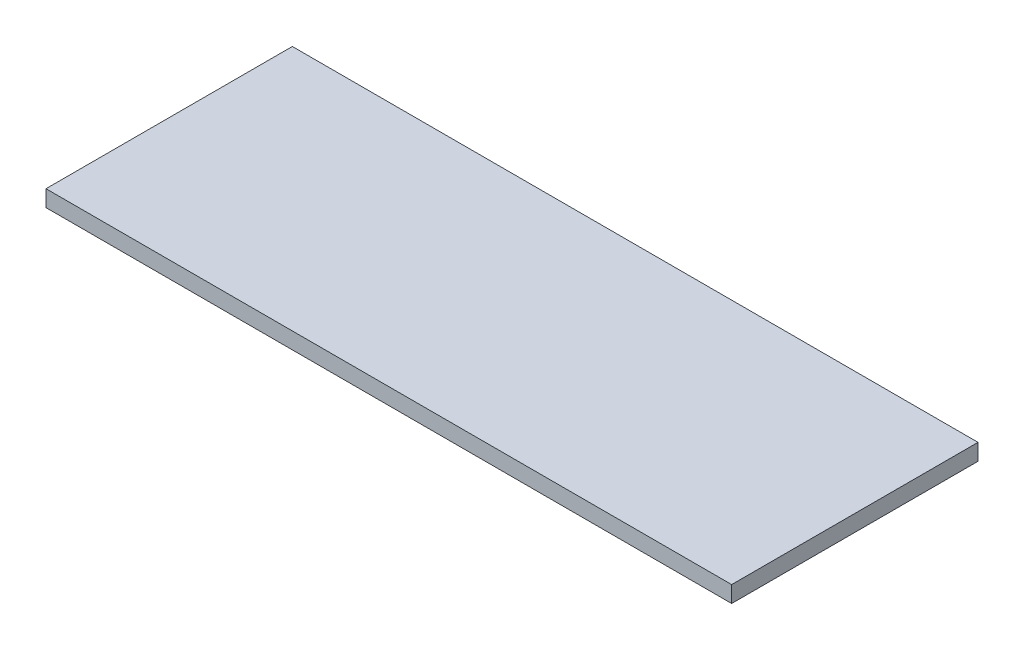
ISO-10303-21;
HEADER;
FILE_DESCRIPTION(('STEP AP214'),'2;1');
FILE_NAME('part.step','',(''),(''),'','','');
FILE_SCHEMA(('AUTOMOTIVE_DESIGN { 1 0 10303 214 1 1 1 1 }'));
ENDSEC;
DATA;
#1=APPLICATION_CONTEXT('core data for automotive mechanical design processes');
#2=APPLICATION_PROTOCOL_DEFINITION('international standard','automotive_design',2000,#1);
#3=PRODUCT_CONTEXT('',#1,'mechanical');
#4=PRODUCT('Part','Part','',(#3));
#5=PRODUCT_RELATED_PRODUCT_CATEGORY('part','',(#4));
#6=PRODUCT_DEFINITION_FORMATION('','',#4);
#7=PRODUCT_DEFINITION_CONTEXT('part definition',#1,'design');
#8=PRODUCT_DEFINITION('design','',#6,#7);
#9=PRODUCT_DEFINITION_SHAPE('','',#8);
#10=(LENGTH_UNIT() NAMED_UNIT(*) SI_UNIT(.MILLI.,.METRE.));
#11=(NAMED_UNIT(*) PLANE_ANGLE_UNIT() SI_UNIT($,.RADIAN.));
#12=(NAMED_UNIT(*) SI_UNIT($,.STERADIAN.) SOLID_ANGLE_UNIT());
#13=UNCERTAINTY_MEASURE_WITH_UNIT(LENGTH_MEASURE(1.E-05),#10,'distance_accuracy_value','');
#14=(GEOMETRIC_REPRESENTATION_CONTEXT(3) GLOBAL_UNCERTAINTY_ASSIGNED_CONTEXT((#13)) GLOBAL_UNIT_ASSIGNED_CONTEXT((#10,
#11,#12)) REPRESENTATION_CONTEXT('',''));
#15=CARTESIAN_POINT('',(0.,0.,0.));
#16=DIRECTION('',(0.,0.,1.));
#17=DIRECTION('',(1.,0.,0.));
#18=AXIS2_PLACEMENT_3D('',#15,#16,#17);
#19=CARTESIAN_POINT('',(83.5,4.,-30.));
#20=DIRECTION('',(-1.,0.,0.));
#21=DIRECTION('',(0.,0.,1.));
#22=AXIS2_PLACEMENT_3D('',#19,#20,#21);
#23=PLANE('',#22);
#24=DIRECTION('',(0.,0.,-1.));
#25=VECTOR('',#24,1.);
#26=CARTESIAN_POINT('',(83.5,0.,-30.));
#27=LINE('',#26,#25);
#28=CARTESIAN_POINT('',(83.5,0.,30.));
#29=VERTEX_POINT('',#28);
#30=CARTESIAN_POINT('',(83.5,0.,-30.));
#31=VERTEX_POINT('',#30);
#32=EDGE_CURVE('E96',#29,#31,#27,.T.);
#33=ORIENTED_EDGE('',*,*,#32,.T.);
#34=DIRECTION('',(0.,-1.,0.));
#35=VECTOR('',#34,1.);
#36=CARTESIAN_POINT('',(83.5,4.,-30.));
#37=LINE('',#36,#35);
#38=CARTESIAN_POINT('',(83.5,4.,-30.));
#39=VERTEX_POINT('',#38);
#40=EDGE_CURVE('E11',#39,#31,#37,.T.);
#41=ORIENTED_EDGE('',*,*,#40,.F.);
#42=DIRECTION('',(0.,0.,-1.));
#43=VECTOR('',#42,1.);
#44=CARTESIAN_POINT('',(83.5,4.,-30.));
#45=LINE('',#44,#43);
#46=CARTESIAN_POINT('',(83.5,4.,30.));
#47=VERTEX_POINT('',#46);
#48=EDGE_CURVE('E84',#47,#39,#45,.T.);
#49=ORIENTED_EDGE('',*,*,#48,.F.);
#50=DIRECTION('',(0.,-1.,0.));
#51=VECTOR('',#50,1.);
#52=CARTESIAN_POINT('',(83.5,4.,30.));
#53=LINE('',#52,#51);
#54=EDGE_CURVE('E92',#47,#29,#53,.T.);
#55=ORIENTED_EDGE('',*,*,#54,.T.);
#56=EDGE_LOOP('',(#33,#41,#49,#55));
#57=FACE_BOUND('',#56,.T.);
#58=ADVANCED_FACE('F33',(#57),#23,.F.);
#59=CARTESIAN_POINT('',(83.5,4.,-30.));
#60=DIRECTION('',(0.,0.,1.));
#61=DIRECTION('',(1.,0.,0.));
#62=AXIS2_PLACEMENT_3D('',#59,#60,#61);
#63=PLANE('',#62);
#64=DIRECTION('',(-1.,0.,0.));
#65=VECTOR('',#64,1.);
#66=CARTESIAN_POINT('',(83.5,0.,-30.));
#67=LINE('',#66,#65);
#68=CARTESIAN_POINT('',(-83.5,0.,-30.));
#69=VERTEX_POINT('',#68);
#70=EDGE_CURVE('E88',#31,#69,#67,.T.);
#71=ORIENTED_EDGE('',*,*,#70,.T.);
#72=DIRECTION('',(0.,-1.,0.));
#73=VECTOR('',#72,1.);
#74=CARTESIAN_POINT('',(-83.5,4.,-30.));
#75=LINE('',#74,#73);
#76=CARTESIAN_POINT('',(-83.5,4.,-30.));
#77=VERTEX_POINT('',#76);
#78=EDGE_CURVE('E41',#77,#69,#75,.T.);
#79=ORIENTED_EDGE('',*,*,#78,.F.);
#80=DIRECTION('',(-1.,0.,0.));
#81=VECTOR('',#80,1.);
#82=CARTESIAN_POINT('',(83.5,4.,-30.));
#83=LINE('',#82,#81);
#84=EDGE_CURVE('E79',#39,#77,#83,.T.);
#85=ORIENTED_EDGE('',*,*,#84,.F.);
#86=ORIENTED_EDGE('',*,*,#40,.T.);
#87=EDGE_LOOP('',(#71,#79,#85,#86));
#88=FACE_BOUND('',#87,.T.);
#89=ADVANCED_FACE('F87',(#88),#63,.F.);
#90=CARTESIAN_POINT('',(-83.5,4.,-30.));
#91=DIRECTION('',(1.,0.,0.));
#92=DIRECTION('',(0.,0.,-1.));
#93=AXIS2_PLACEMENT_3D('',#90,#91,#92);
#94=PLANE('',#93);
#95=DIRECTION('',(0.,0.,1.));
#96=VECTOR('',#95,1.);
#97=CARTESIAN_POINT('',(-83.5,0.,-30.));
#98=LINE('',#97,#96);
#99=CARTESIAN_POINT('',(-83.5,0.,30.));
#100=VERTEX_POINT('',#99);
#101=EDGE_CURVE('E66',#69,#100,#98,.T.);
#102=ORIENTED_EDGE('',*,*,#101,.T.);
#103=DIRECTION('',(0.,-1.,0.));
#104=VECTOR('',#103,1.);
#105=CARTESIAN_POINT('',(-83.5,4.,30.));
#106=LINE('',#105,#104);
#107=CARTESIAN_POINT('',(-83.5,4.,30.));
#108=VERTEX_POINT('',#107);
#109=EDGE_CURVE('E89',#108,#100,#106,.T.);
#110=ORIENTED_EDGE('',*,*,#109,.F.);
#111=DIRECTION('',(0.,0.,1.));
#112=VECTOR('',#111,1.);
#113=CARTESIAN_POINT('',(-83.5,4.,-30.));
#114=LINE('',#113,#112);
#115=EDGE_CURVE('E82',#77,#108,#114,.T.);
#116=ORIENTED_EDGE('',*,*,#115,.F.);
#117=ORIENTED_EDGE('',*,*,#78,.T.);
#118=EDGE_LOOP('',(#102,#110,#116,#117));
#119=FACE_BOUND('',#118,.T.);
#120=ADVANCED_FACE('F90',(#119),#94,.F.);
#121=CARTESIAN_POINT('',(83.5,4.,30.));
#122=DIRECTION('',(0.,0.,-1.));
#123=DIRECTION('',(-1.,0.,0.));
#124=AXIS2_PLACEMENT_3D('',#121,#122,#123);
#125=PLANE('',#124);
#126=DIRECTION('',(1.,0.,0.));
#127=VECTOR('',#126,1.);
#128=CARTESIAN_POINT('',(83.5,0.,30.));
#129=LINE('',#128,#127);
#130=EDGE_CURVE('E72',#100,#29,#129,.T.);
#131=ORIENTED_EDGE('',*,*,#130,.T.);
#132=ORIENTED_EDGE('',*,*,#54,.F.);
#133=DIRECTION('',(1.,0.,0.));
#134=VECTOR('',#133,1.);
#135=CARTESIAN_POINT('',(83.5,4.,30.));
#136=LINE('',#135,#134);
#137=EDGE_CURVE('E49',#108,#47,#136,.T.);
#138=ORIENTED_EDGE('',*,*,#137,.F.);
#139=ORIENTED_EDGE('',*,*,#109,.T.);
#140=EDGE_LOOP('',(#131,#132,#138,#139));
#141=FACE_BOUND('',#140,.T.);
#142=ADVANCED_FACE('F103',(#141),#125,.F.);
#143=CARTESIAN_POINT('',(0.,4.,0.));
#144=DIRECTION('',(0.,-1.,0.));
#145=DIRECTION('',(0.,0.,-1.));
#146=AXIS2_PLACEMENT_3D('',#143,#144,#145);
#147=PLANE('',#146);
#148=ORIENTED_EDGE('',*,*,#48,.T.);
#149=ORIENTED_EDGE('',*,*,#84,.T.);
#150=ORIENTED_EDGE('',*,*,#115,.T.);
#151=ORIENTED_EDGE('',*,*,#137,.T.);
#152=EDGE_LOOP('',(#148,#149,#150,#151));
#153=FACE_BOUND('',#152,.T.);
#154=ADVANCED_FACE('F80',(#153),#147,.F.);
#155=CARTESIAN_POINT('',(0.,0.,0.));
#156=DIRECTION('',(0.,-1.,0.));
#157=DIRECTION('',(0.,0.,-1.));
#158=AXIS2_PLACEMENT_3D('',#155,#156,#157);
#159=PLANE('',#158);
#160=ORIENTED_EDGE('',*,*,#32,.F.);
#161=ORIENTED_EDGE('',*,*,#130,.F.);
#162=ORIENTED_EDGE('',*,*,#101,.F.);
#163=ORIENTED_EDGE('',*,*,#70,.F.);
#164=EDGE_LOOP('',(#160,#161,#162,#163));
#165=FACE_BOUND('',#164,.T.);
#166=ADVANCED_FACE('F106',(#165),#159,.T.);
#167=CLOSED_SHELL('',(#58,#89,#120,#142,#154,#166));
#168=MANIFOLD_SOLID_BREP('B2',#167);
#169=ADVANCED_BREP_SHAPE_REPRESENTATION('',(#18,#168),#14);
#170=SHAPE_DEFINITION_REPRESENTATION(#9,#169);
ENDSEC;
END-ISO-10303-21;
